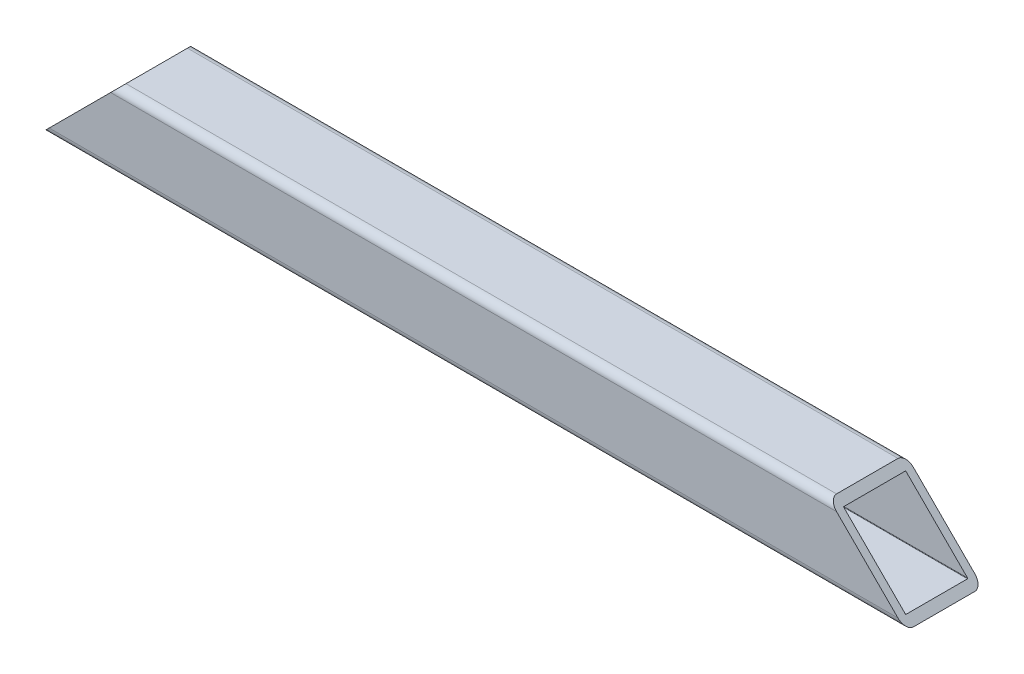
ISO-10303-21;
HEADER;
FILE_DESCRIPTION(('STEP AP214'),'2;1');
FILE_NAME('part.step','',(''),(''),'','','');
FILE_SCHEMA(('AUTOMOTIVE_DESIGN { 1 0 10303 214 1 1 1 1 }'));
ENDSEC;
DATA;
#1=APPLICATION_CONTEXT('core data for automotive mechanical design processes');
#2=APPLICATION_PROTOCOL_DEFINITION('international standard','automotive_design',2000,#1);
#3=PRODUCT_CONTEXT('',#1,'mechanical');
#4=PRODUCT('Part','Part','',(#3));
#5=PRODUCT_RELATED_PRODUCT_CATEGORY('part','',(#4));
#6=PRODUCT_DEFINITION_FORMATION('','',#4);
#7=PRODUCT_DEFINITION_CONTEXT('part definition',#1,'design');
#8=PRODUCT_DEFINITION('design','',#6,#7);
#9=PRODUCT_DEFINITION_SHAPE('','',#8);
#10=(LENGTH_UNIT() NAMED_UNIT(*) SI_UNIT(.MILLI.,.METRE.));
#11=(NAMED_UNIT(*) PLANE_ANGLE_UNIT() SI_UNIT($,.RADIAN.));
#12=(NAMED_UNIT(*) SI_UNIT($,.STERADIAN.) SOLID_ANGLE_UNIT());
#13=UNCERTAINTY_MEASURE_WITH_UNIT(LENGTH_MEASURE(1.E-05),#10,'distance_accuracy_value','');
#14=(GEOMETRIC_REPRESENTATION_CONTEXT(3) GLOBAL_UNCERTAINTY_ASSIGNED_CONTEXT((#13)) GLOBAL_UNIT_ASSIGNED_CONTEXT((#10,
#11,#12)) REPRESENTATION_CONTEXT('',''));
#15=CARTESIAN_POINT('',(0.,0.,0.));
#16=DIRECTION('',(0.,0.,1.));
#17=DIRECTION('',(1.,0.,0.));
#18=AXIS2_PLACEMENT_3D('',#15,#16,#17);
#19=CARTESIAN_POINT('',(216.991709104377,12.7,10.16));
#20=DIRECTION('',(0.,-1.,0.));
#21=DIRECTION('',(0.,0.,-1.));
#22=AXIS2_PLACEMENT_3D('',#19,#20,#21);
#23=PLANE('',#22);
#24=DIRECTION('',(-1.,0.,0.));
#25=VECTOR('',#24,1.);
#26=CARTESIAN_POINT('',(216.991709104377,12.7,-10.16));
#27=LINE('',#26,#25);
#28=CARTESIAN_POINT('',(191.591709104377,12.7,-10.16));
#29=VERTEX_POINT('',#28);
#30=CARTESIAN_POINT('',(-43.3582908956227,12.7,-10.16));
#31=VERTEX_POINT('',#30);
#32=EDGE_CURVE('E237',#29,#31,#27,.T.);
#33=ORIENTED_EDGE('',*,*,#32,.T.);
#34=DIRECTION('',(0.,0.,1.));
#35=VECTOR('',#34,1.);
#36=CARTESIAN_POINT('',(-43.3582908956227,12.7,-12.7));
#37=LINE('',#36,#35);
#38=CARTESIAN_POINT('',(-43.3582908956227,12.7,10.16));
#39=VERTEX_POINT('',#38);
#40=EDGE_CURVE('E306',#31,#39,#37,.T.);
#41=ORIENTED_EDGE('',*,*,#40,.T.);
#42=DIRECTION('',(-1.,0.,0.));
#43=VECTOR('',#42,1.);
#44=CARTESIAN_POINT('',(216.991709104377,12.7,10.16));
#45=LINE('',#44,#43);
#46=CARTESIAN_POINT('',(191.591709104377,12.7,10.16));
#47=VERTEX_POINT('',#46);
#48=EDGE_CURVE('E231',#47,#39,#45,.T.);
#49=ORIENTED_EDGE('',*,*,#48,.F.);
#50=DIRECTION('',(0.,0.,1.));
#51=VECTOR('',#50,1.);
#52=CARTESIAN_POINT('',(191.591709104377,12.7,-12.7));
#53=LINE('',#52,#51);
#54=EDGE_CURVE('E195',#29,#47,#53,.T.);
#55=ORIENTED_EDGE('',*,*,#54,.F.);
#56=EDGE_LOOP('',(#33,#41,#49,#55));
#57=FACE_BOUND('',#56,.T.);
#58=ADVANCED_FACE('F61',(#57),#23,.F.);
#59=CARTESIAN_POINT('',(216.991709104377,10.16,-10.16));
#60=DIRECTION('',(-1.,0.,0.));
#61=DIRECTION('',(0.,0.,1.));
#62=AXIS2_PLACEMENT_3D('',#59,#60,#61);
#63=CYLINDRICAL_SURFACE('',#62,2.54);
#64=DIRECTION('',(-1.,0.,0.));
#65=VECTOR('',#64,1.);
#66=CARTESIAN_POINT('',(216.991709104377,10.16,-12.7));
#67=LINE('',#66,#65);
#68=CARTESIAN_POINT('',(194.131709104377,10.16,-12.7));
#69=VERTEX_POINT('',#68);
#70=CARTESIAN_POINT('',(-45.8982908956227,10.16,-12.7));
#71=VERTEX_POINT('',#70);
#72=EDGE_CURVE('E243',#69,#71,#67,.T.);
#73=ORIENTED_EDGE('',*,*,#72,.T.);
#74=CARTESIAN_POINT('',(-45.8982908956227,10.16,-10.16));
#75=DIRECTION('',(0.707106781186544,-0.707106781186551,0.));
#76=DIRECTION('',(-0.707106781186551,-0.707106781186544,0.));
#77=AXIS2_PLACEMENT_3D('',#74,#75,#76);
#78=ELLIPSE('',#77,3.59210244842768,2.54);
#79=EDGE_CURVE('E288',#71,#31,#78,.T.);
#80=ORIENTED_EDGE('',*,*,#79,.T.);
#81=ORIENTED_EDGE('',*,*,#32,.F.);
#82=CARTESIAN_POINT('',(194.131709104377,10.16,-10.16));
#83=DIRECTION('',(-0.707106781186549,-0.707106781186546,0.));
#84=DIRECTION('',(-0.707106781186546,0.707106781186549,0.));
#85=AXIS2_PLACEMENT_3D('',#82,#83,#84);
#86=ELLIPSE('',#85,3.59210244842766,2.54);
#87=EDGE_CURVE('E268',#29,#69,#86,.T.);
#88=ORIENTED_EDGE('',*,*,#87,.T.);
#89=EDGE_LOOP('',(#73,#80,#81,#88));
#90=FACE_BOUND('',#89,.T.);
#91=ADVANCED_FACE('F320',(#90),#63,.T.);
#92=CARTESIAN_POINT('',(216.991709104377,-10.16,-12.7));
#93=DIRECTION('',(0.,0.,1.));
#94=DIRECTION('',(1.,0.,0.));
#95=AXIS2_PLACEMENT_3D('',#92,#93,#94);
#96=PLANE('',#95);
#97=DIRECTION('',(-1.,0.,0.));
#98=VECTOR('',#97,1.);
#99=CARTESIAN_POINT('',(216.991709104377,-10.16,-12.7));
#100=LINE('',#99,#98);
#101=CARTESIAN_POINT('',(214.451709104377,-10.16,-12.7));
#102=VERTEX_POINT('',#101);
#103=CARTESIAN_POINT('',(-66.2182908956229,-10.16,-12.7));
#104=VERTEX_POINT('',#103);
#105=EDGE_CURVE('E250',#102,#104,#100,.T.);
#106=ORIENTED_EDGE('',*,*,#105,.T.);
#107=DIRECTION('',(0.707106781186551,0.707106781186544,0.));
#108=VECTOR('',#107,1.);
#109=CARTESIAN_POINT('',(-68.7582908956229,-12.7,-12.7));
#110=LINE('',#109,#108);
#111=EDGE_CURVE('E194',#104,#71,#110,.T.);
#112=ORIENTED_EDGE('',*,*,#111,.T.);
#113=ORIENTED_EDGE('',*,*,#72,.F.);
#114=DIRECTION('',(0.707106781186546,-0.707106781186549,0.));
#115=VECTOR('',#114,1.);
#116=CARTESIAN_POINT('',(216.991709104377,-12.7,-12.7));
#117=LINE('',#116,#115);
#118=EDGE_CURVE('E308',#69,#102,#117,.T.);
#119=ORIENTED_EDGE('',*,*,#118,.T.);
#120=EDGE_LOOP('',(#106,#112,#113,#119));
#121=FACE_BOUND('',#120,.T.);
#122=ADVANCED_FACE('F318',(#121),#96,.F.);
#123=CARTESIAN_POINT('',(216.991709104377,-12.7,-10.16));
#124=DIRECTION('',(0.,1.,0.));
#125=DIRECTION('',(0.,0.,1.));
#126=AXIS2_PLACEMENT_3D('',#123,#124,#125);
#127=PLANE('',#126);
#128=DIRECTION('',(0.,0.,-1.));
#129=VECTOR('',#128,1.);
#130=CARTESIAN_POINT('',(-68.7582908956229,-12.7,-10.16));
#131=LINE('',#130,#129);
#132=CARTESIAN_POINT('',(-68.7582908956229,-12.7,10.16));
#133=VERTEX_POINT('',#132);
#134=CARTESIAN_POINT('',(-68.7582908956229,-12.7,-10.16));
#135=VERTEX_POINT('',#134);
#136=EDGE_CURVE('E181',#133,#135,#131,.T.);
#137=ORIENTED_EDGE('',*,*,#136,.T.);
#138=DIRECTION('',(-1.,0.,0.));
#139=VECTOR('',#138,1.);
#140=CARTESIAN_POINT('',(216.991709104377,-12.7,-10.16));
#141=LINE('',#140,#139);
#142=CARTESIAN_POINT('',(216.991709104377,-12.7,-10.16));
#143=VERTEX_POINT('',#142);
#144=EDGE_CURVE('E202',#143,#135,#141,.T.);
#145=ORIENTED_EDGE('',*,*,#144,.F.);
#146=DIRECTION('',(0.,0.,-1.));
#147=VECTOR('',#146,1.);
#148=CARTESIAN_POINT('',(216.991709104377,-12.7,-10.16));
#149=LINE('',#148,#147);
#150=CARTESIAN_POINT('',(216.991709104377,-12.7,10.16));
#151=VERTEX_POINT('',#150);
#152=EDGE_CURVE('E210',#151,#143,#149,.T.);
#153=ORIENTED_EDGE('',*,*,#152,.F.);
#154=DIRECTION('',(-1.,0.,0.));
#155=VECTOR('',#154,1.);
#156=CARTESIAN_POINT('',(216.991709104377,-12.7,10.16));
#157=LINE('',#156,#155);
#158=EDGE_CURVE('E200',#151,#133,#157,.T.);
#159=ORIENTED_EDGE('',*,*,#158,.T.);
#160=EDGE_LOOP('',(#137,#145,#153,#159));
#161=FACE_BOUND('',#160,.T.);
#162=ADVANCED_FACE('F262',(#161),#127,.F.);
#163=CARTESIAN_POINT('',(216.991709104377,-10.16,-10.16));
#164=DIRECTION('',(-1.,0.,0.));
#165=DIRECTION('',(0.,0.,1.));
#166=AXIS2_PLACEMENT_3D('',#163,#164,#165);
#167=CYLINDRICAL_SURFACE('',#166,2.54);
#168=ORIENTED_EDGE('',*,*,#144,.T.);
#169=CARTESIAN_POINT('',(-66.2182908956229,-10.16,-10.16));
#170=DIRECTION('',(0.707106781186544,-0.707106781186551,0.));
#171=DIRECTION('',(-0.707106781186551,-0.707106781186544,0.));
#172=AXIS2_PLACEMENT_3D('',#169,#170,#171);
#173=ELLIPSE('',#172,3.59210244842768,2.54);
#174=EDGE_CURVE('E187',#135,#104,#173,.T.);
#175=ORIENTED_EDGE('',*,*,#174,.T.);
#176=ORIENTED_EDGE('',*,*,#105,.F.);
#177=CARTESIAN_POINT('',(214.451709104377,-10.16,-10.16));
#178=DIRECTION('',(-0.707106781186549,-0.707106781186546,0.));
#179=DIRECTION('',(-0.707106781186546,0.707106781186549,0.));
#180=AXIS2_PLACEMENT_3D('',#177,#178,#179);
#181=ELLIPSE('',#180,3.59210244842766,2.54);
#182=EDGE_CURVE('E259',#102,#143,#181,.T.);
#183=ORIENTED_EDGE('',*,*,#182,.T.);
#184=EDGE_LOOP('',(#168,#175,#176,#183));
#185=FACE_BOUND('',#184,.T.);
#186=ADVANCED_FACE('F257',(#185),#167,.T.);
#187=CARTESIAN_POINT('',(216.991709104377,-10.16,10.16));
#188=DIRECTION('',(-1.,0.,0.));
#189=DIRECTION('',(0.,0.,1.));
#190=AXIS2_PLACEMENT_3D('',#187,#188,#189);
#191=CYLINDRICAL_SURFACE('',#190,2.54);
#192=DIRECTION('',(-1.,0.,0.));
#193=VECTOR('',#192,1.);
#194=CARTESIAN_POINT('',(216.991709104377,-10.16,12.7));
#195=LINE('',#194,#193);
#196=CARTESIAN_POINT('',(214.451709104377,-10.16,12.7));
#197=VERTEX_POINT('',#196);
#198=CARTESIAN_POINT('',(-66.218290895623,-10.16,12.7));
#199=VERTEX_POINT('',#198);
#200=EDGE_CURVE('E70',#197,#199,#195,.T.);
#201=ORIENTED_EDGE('',*,*,#200,.T.);
#202=CARTESIAN_POINT('',(-66.2182908956229,-10.16,10.16));
#203=DIRECTION('',(0.707106781186544,-0.707106781186551,0.));
#204=DIRECTION('',(-0.707106781186551,-0.707106781186544,0.));
#205=AXIS2_PLACEMENT_3D('',#202,#203,#204);
#206=ELLIPSE('',#205,3.59210244842768,2.54);
#207=EDGE_CURVE('E175',#199,#133,#206,.T.);
#208=ORIENTED_EDGE('',*,*,#207,.T.);
#209=ORIENTED_EDGE('',*,*,#158,.F.);
#210=CARTESIAN_POINT('',(214.451709104377,-10.16,10.16));
#211=DIRECTION('',(-0.707106781186549,-0.707106781186546,0.));
#212=DIRECTION('',(-0.707106781186546,0.707106781186549,0.));
#213=AXIS2_PLACEMENT_3D('',#210,#211,#212);
#214=ELLIPSE('',#213,3.59210244842766,2.54);
#215=EDGE_CURVE('E199',#151,#197,#214,.T.);
#216=ORIENTED_EDGE('',*,*,#215,.T.);
#217=EDGE_LOOP('',(#201,#208,#209,#216));
#218=FACE_BOUND('',#217,.T.);
#219=ADVANCED_FACE('F198',(#218),#191,.T.);
#220=CARTESIAN_POINT('',(216.991709104377,10.16,12.7));
#221=DIRECTION('',(0.,0.,-1.));
#222=DIRECTION('',(-1.,0.,0.));
#223=AXIS2_PLACEMENT_3D('',#220,#221,#222);
#224=PLANE('',#223);
#225=DIRECTION('',(-1.,0.,0.));
#226=VECTOR('',#225,1.);
#227=CARTESIAN_POINT('',(216.991709104377,10.16,12.7));
#228=LINE('',#227,#226);
#229=CARTESIAN_POINT('',(194.131709104377,10.16,12.7));
#230=VERTEX_POINT('',#229);
#231=CARTESIAN_POINT('',(-45.8982908956227,10.16,12.7));
#232=VERTEX_POINT('',#231);
#233=EDGE_CURVE('E12',#230,#232,#228,.T.);
#234=ORIENTED_EDGE('',*,*,#233,.T.);
#235=DIRECTION('',(0.707106781186551,0.707106781186544,0.));
#236=VECTOR('',#235,1.);
#237=CARTESIAN_POINT('',(-68.7582908956229,-12.7,12.7));
#238=LINE('',#237,#236);
#239=EDGE_CURVE('E178',#199,#232,#238,.T.);
#240=ORIENTED_EDGE('',*,*,#239,.F.);
#241=ORIENTED_EDGE('',*,*,#200,.F.);
#242=DIRECTION('',(0.707106781186546,-0.707106781186549,0.));
#243=VECTOR('',#242,1.);
#244=CARTESIAN_POINT('',(216.991709104377,-12.7,12.7));
#245=LINE('',#244,#243);
#246=EDGE_CURVE('E311',#230,#197,#245,.T.);
#247=ORIENTED_EDGE('',*,*,#246,.F.);
#248=EDGE_LOOP('',(#234,#240,#241,#247));
#249=FACE_BOUND('',#248,.T.);
#250=ADVANCED_FACE('F191',(#249),#224,.F.);
#251=CARTESIAN_POINT('',(216.991709104377,10.16,10.16));
#252=DIRECTION('',(-1.,0.,0.));
#253=DIRECTION('',(0.,0.,1.));
#254=AXIS2_PLACEMENT_3D('',#251,#252,#253);
#255=CYLINDRICAL_SURFACE('',#254,2.54);
#256=ORIENTED_EDGE('',*,*,#48,.T.);
#257=CARTESIAN_POINT('',(-45.8982908956227,10.16,10.16));
#258=DIRECTION('',(0.707106781186544,-0.707106781186551,0.));
#259=DIRECTION('',(-0.707106781186551,-0.707106781186544,0.));
#260=AXIS2_PLACEMENT_3D('',#257,#258,#259);
#261=ELLIPSE('',#260,3.59210244842768,2.54);
#262=EDGE_CURVE('E186',#39,#232,#261,.T.);
#263=ORIENTED_EDGE('',*,*,#262,.T.);
#264=ORIENTED_EDGE('',*,*,#233,.F.);
#265=CARTESIAN_POINT('',(194.131709104377,10.16,10.16));
#266=DIRECTION('',(-0.707106781186549,-0.707106781186546,0.));
#267=DIRECTION('',(-0.707106781186546,0.707106781186549,0.));
#268=AXIS2_PLACEMENT_3D('',#265,#266,#267);
#269=ELLIPSE('',#268,3.59210244842766,2.54);
#270=EDGE_CURVE('E263',#230,#47,#269,.T.);
#271=ORIENTED_EDGE('',*,*,#270,.T.);
#272=EDGE_LOOP('',(#256,#263,#264,#271));
#273=FACE_BOUND('',#272,.T.);
#274=ADVANCED_FACE('F326',(#273),#255,.T.);
#275=CARTESIAN_POINT('',(-68.7582908956229,-12.7,-12.7));
#276=DIRECTION('',(0.707106781186544,-0.707106781186551,0.));
#277=DIRECTION('',(0.707106781186551,0.707106781186544,0.));
#278=AXIS2_PLACEMENT_3D('',#275,#276,#277);
#279=PLANE('',#278);
#280=CARTESIAN_POINT('',(-66.2182908956229,-10.16,10.16));
#281=DIRECTION('',(0.707106781186544,-0.707106781186551,0.));
#282=DIRECTION('',(-0.707106781186551,-0.707106781186544,0.));
#283=AXIS2_PLACEMENT_3D('',#280,#281,#282);
#284=ELLIPSE('',#283,0.179605122421387,0.127000000000002);
#285=CARTESIAN_POINT('',(-66.2182908956229,-10.16,10.287));
#286=VERTEX_POINT('',#285);
#287=CARTESIAN_POINT('',(-66.3452908956229,-10.287,10.16));
#288=VERTEX_POINT('',#287);
#289=EDGE_CURVE('E86',#286,#288,#284,.T.);
#290=ORIENTED_EDGE('',*,*,#289,.T.);
#291=DIRECTION('',(0.,0.,-1.));
#292=VECTOR('',#291,1.);
#293=CARTESIAN_POINT('',(-66.3452908956229,-10.287,-10.16));
#294=LINE('',#293,#292);
#295=CARTESIAN_POINT('',(-66.3452908956229,-10.287,-10.16));
#296=VERTEX_POINT('',#295);
#297=EDGE_CURVE('E304',#288,#296,#294,.T.);
#298=ORIENTED_EDGE('',*,*,#297,.T.);
#299=CARTESIAN_POINT('',(-66.2182908956229,-10.16,-10.16));
#300=DIRECTION('',(0.707106781186544,-0.707106781186551,0.));
#301=DIRECTION('',(-0.707106781186551,-0.707106781186544,0.));
#302=AXIS2_PLACEMENT_3D('',#299,#300,#301);
#303=ELLIPSE('',#302,0.179605122421387,0.127000000000002);
#304=CARTESIAN_POINT('',(-66.2182908956229,-10.16,-10.287));
#305=VERTEX_POINT('',#304);
#306=EDGE_CURVE('E302',#296,#305,#303,.T.);
#307=ORIENTED_EDGE('',*,*,#306,.T.);
#308=DIRECTION('',(0.707106781186551,0.707106781186544,0.));
#309=VECTOR('',#308,1.);
#310=CARTESIAN_POINT('',(75.3867091043785,131.445,-10.287));
#311=LINE('',#310,#309);
#312=CARTESIAN_POINT('',(-45.8982908956227,10.16,-10.287));
#313=VERTEX_POINT('',#312);
#314=EDGE_CURVE('E300',#305,#313,#311,.T.);
#315=ORIENTED_EDGE('',*,*,#314,.T.);
#316=CARTESIAN_POINT('',(-45.8982908956227,10.16,-10.16));
#317=DIRECTION('',(0.707106781186544,-0.707106781186551,0.));
#318=DIRECTION('',(-0.707106781186551,-0.707106781186544,0.));
#319=AXIS2_PLACEMENT_3D('',#316,#317,#318);
#320=ELLIPSE('',#319,0.179605122421387,0.127000000000002);
#321=CARTESIAN_POINT('',(-45.7712908956227,10.287,-10.16));
#322=VERTEX_POINT('',#321);
#323=EDGE_CURVE('E298',#313,#322,#320,.T.);
#324=ORIENTED_EDGE('',*,*,#323,.T.);
#325=DIRECTION('',(0.,0.,1.));
#326=VECTOR('',#325,1.);
#327=CARTESIAN_POINT('',(-45.7712908956227,10.287,10.16));
#328=LINE('',#327,#326);
#329=CARTESIAN_POINT('',(-45.7712908956227,10.287,10.16));
#330=VERTEX_POINT('',#329);
#331=EDGE_CURVE('E296',#322,#330,#328,.T.);
#332=ORIENTED_EDGE('',*,*,#331,.T.);
#333=CARTESIAN_POINT('',(-45.8982908956227,10.16,10.16));
#334=DIRECTION('',(0.707106781186544,-0.707106781186551,0.));
#335=DIRECTION('',(-0.707106781186551,-0.707106781186544,0.));
#336=AXIS2_PLACEMENT_3D('',#333,#334,#335);
#337=ELLIPSE('',#336,0.179605122421387,0.127000000000002);
#338=CARTESIAN_POINT('',(-45.8982908956227,10.16,10.287));
#339=VERTEX_POINT('',#338);
#340=EDGE_CURVE('E294',#330,#339,#337,.T.);
#341=ORIENTED_EDGE('',*,*,#340,.T.);
#342=DIRECTION('',(-0.707106781186551,-0.707106781186544,0.));
#343=VECTOR('',#342,1.);
#344=CARTESIAN_POINT('',(85.5467091043785,141.605,10.287));
#345=LINE('',#344,#343);
#346=EDGE_CURVE('E292',#339,#286,#345,.T.);
#347=ORIENTED_EDGE('',*,*,#346,.T.);
#348=EDGE_LOOP('',(#290,#298,#307,#315,#324,#332,#341,#347));
#349=FACE_BOUND('',#348,.T.);
#350=ORIENTED_EDGE('',*,*,#40,.F.);
#351=ORIENTED_EDGE('',*,*,#79,.F.);
#352=ORIENTED_EDGE('',*,*,#111,.F.);
#353=ORIENTED_EDGE('',*,*,#174,.F.);
#354=ORIENTED_EDGE('',*,*,#136,.F.);
#355=ORIENTED_EDGE('',*,*,#207,.F.);
#356=ORIENTED_EDGE('',*,*,#239,.T.);
#357=ORIENTED_EDGE('',*,*,#262,.F.);
#358=EDGE_LOOP('',(#350,#351,#352,#353,#354,#355,#356,#357));
#359=FACE_BOUND('',#358,.T.);
#360=ADVANCED_FACE('F177',(#349,#359),#279,.F.);
#361=CARTESIAN_POINT('',(216.991709104377,-12.7,-12.7));
#362=DIRECTION('',(-0.707106781186549,-0.707106781186546,0.));
#363=DIRECTION('',(0.707106781186546,-0.707106781186549,0.));
#364=AXIS2_PLACEMENT_3D('',#361,#362,#363);
#365=PLANE('',#364);
#366=CARTESIAN_POINT('',(214.451709104377,-10.16,10.16));
#367=DIRECTION('',(-0.707106781186549,-0.707106781186546,0.));
#368=DIRECTION('',(-0.707106781186546,0.707106781186549,0.));
#369=AXIS2_PLACEMENT_3D('',#366,#367,#368);
#370=ELLIPSE('',#369,0.179605122421386,0.127000000000002);
#371=CARTESIAN_POINT('',(214.578709104377,-10.287,10.16));
#372=VERTEX_POINT('',#371);
#373=CARTESIAN_POINT('',(214.451709104377,-10.16,10.287));
#374=VERTEX_POINT('',#373);
#375=EDGE_CURVE('E271',#372,#374,#370,.T.);
#376=ORIENTED_EDGE('',*,*,#375,.T.);
#377=DIRECTION('',(-0.707106781186546,0.707106781186549,0.));
#378=VECTOR('',#377,1.);
#379=CARTESIAN_POINT('',(205.561709104377,-1.26999999999996,10.287));
#380=LINE('',#379,#378);
#381=CARTESIAN_POINT('',(194.131709104377,10.16,10.287));
#382=VERTEX_POINT('',#381);
#383=EDGE_CURVE('E273',#374,#382,#380,.T.);
#384=ORIENTED_EDGE('',*,*,#383,.T.);
#385=CARTESIAN_POINT('',(194.131709104377,10.16,10.16));
#386=DIRECTION('',(-0.707106781186549,-0.707106781186546,0.));
#387=DIRECTION('',(-0.707106781186546,0.707106781186549,0.));
#388=AXIS2_PLACEMENT_3D('',#385,#386,#387);
#389=ELLIPSE('',#388,0.179605122421386,0.127000000000002);
#390=CARTESIAN_POINT('',(194.004709104377,10.287,10.16));
#391=VERTEX_POINT('',#390);
#392=EDGE_CURVE('E275',#382,#391,#389,.T.);
#393=ORIENTED_EDGE('',*,*,#392,.T.);
#394=DIRECTION('',(0.,0.,-1.));
#395=VECTOR('',#394,1.);
#396=CARTESIAN_POINT('',(194.004709104377,10.287,10.16));
#397=LINE('',#396,#395);
#398=CARTESIAN_POINT('',(194.004709104377,10.287,-10.16));
#399=VERTEX_POINT('',#398);
#400=EDGE_CURVE('E277',#391,#399,#397,.T.);
#401=ORIENTED_EDGE('',*,*,#400,.T.);
#402=CARTESIAN_POINT('',(194.131709104377,10.16,-10.16));
#403=DIRECTION('',(-0.707106781186549,-0.707106781186546,0.));
#404=DIRECTION('',(-0.707106781186546,0.707106781186549,0.));
#405=AXIS2_PLACEMENT_3D('',#402,#403,#404);
#406=ELLIPSE('',#405,0.179605122421386,0.127000000000002);
#407=CARTESIAN_POINT('',(194.131709104377,10.16,-10.287));
#408=VERTEX_POINT('',#407);
#409=EDGE_CURVE('E279',#399,#408,#406,.T.);
#410=ORIENTED_EDGE('',*,*,#409,.T.);
#411=DIRECTION('',(0.707106781186546,-0.707106781186549,0.));
#412=VECTOR('',#411,1.);
#413=CARTESIAN_POINT('',(215.721709104377,-11.43,-10.287));
#414=LINE('',#413,#412);
#415=CARTESIAN_POINT('',(214.451709104377,-10.16,-10.287));
#416=VERTEX_POINT('',#415);
#417=EDGE_CURVE('E281',#408,#416,#414,.T.);
#418=ORIENTED_EDGE('',*,*,#417,.T.);
#419=CARTESIAN_POINT('',(214.451709104377,-10.16,-10.16));
#420=DIRECTION('',(-0.707106781186549,-0.707106781186546,0.));
#421=DIRECTION('',(-0.707106781186546,0.707106781186549,0.));
#422=AXIS2_PLACEMENT_3D('',#419,#420,#421);
#423=ELLIPSE('',#422,0.179605122421386,0.127000000000002);
#424=CARTESIAN_POINT('',(214.578709104377,-10.287,-10.16));
#425=VERTEX_POINT('',#424);
#426=EDGE_CURVE('E78',#416,#425,#423,.T.);
#427=ORIENTED_EDGE('',*,*,#426,.T.);
#428=DIRECTION('',(0.,0.,1.));
#429=VECTOR('',#428,1.);
#430=CARTESIAN_POINT('',(214.578709104377,-10.287,-10.16));
#431=LINE('',#430,#429);
#432=EDGE_CURVE('E284',#425,#372,#431,.T.);
#433=ORIENTED_EDGE('',*,*,#432,.T.);
#434=EDGE_LOOP('',(#376,#384,#393,#401,#410,#418,#427,#433));
#435=FACE_BOUND('',#434,.T.);
#436=ORIENTED_EDGE('',*,*,#246,.T.);
#437=ORIENTED_EDGE('',*,*,#215,.F.);
#438=ORIENTED_EDGE('',*,*,#152,.T.);
#439=ORIENTED_EDGE('',*,*,#182,.F.);
#440=ORIENTED_EDGE('',*,*,#118,.F.);
#441=ORIENTED_EDGE('',*,*,#87,.F.);
#442=ORIENTED_EDGE('',*,*,#54,.T.);
#443=ORIENTED_EDGE('',*,*,#270,.F.);
#444=EDGE_LOOP('',(#436,#437,#438,#439,#440,#441,#442,#443));
#445=FACE_BOUND('',#444,.T.);
#446=ADVANCED_FACE('F324',(#435,#445),#365,.F.);
#447=CARTESIAN_POINT('',(216.991709104377,-10.16,10.16));
#448=DIRECTION('',(-1.,0.,0.));
#449=DIRECTION('',(0.,0.,1.));
#450=AXIS2_PLACEMENT_3D('',#447,#448,#449);
#451=CYLINDRICAL_SURFACE('',#450,0.127000000000002);
#452=ORIENTED_EDGE('',*,*,#289,.F.);
#453=DIRECTION('',(-1.,0.,0.));
#454=VECTOR('',#453,1.);
#455=CARTESIAN_POINT('',(216.991709104377,-10.16,10.287));
#456=LINE('',#455,#454);
#457=EDGE_CURVE('E65',#374,#286,#456,.T.);
#458=ORIENTED_EDGE('',*,*,#457,.F.);
#459=ORIENTED_EDGE('',*,*,#375,.F.);
#460=DIRECTION('',(-1.,0.,0.));
#461=VECTOR('',#460,1.);
#462=CARTESIAN_POINT('',(216.991709104377,-10.287,10.16));
#463=LINE('',#462,#461);
#464=EDGE_CURVE('E206',#372,#288,#463,.T.);
#465=ORIENTED_EDGE('',*,*,#464,.T.);
#466=EDGE_LOOP('',(#452,#458,#459,#465));
#467=FACE_BOUND('',#466,.T.);
#468=ADVANCED_FACE('F63',(#467),#451,.F.);
#469=CARTESIAN_POINT('',(216.991709104377,10.16,10.287));
#470=DIRECTION('',(0.,0.,-1.));
#471=DIRECTION('',(-1.,0.,0.));
#472=AXIS2_PLACEMENT_3D('',#469,#470,#471);
#473=PLANE('',#472);
#474=ORIENTED_EDGE('',*,*,#346,.F.);
#475=DIRECTION('',(-1.,0.,0.));
#476=VECTOR('',#475,1.);
#477=CARTESIAN_POINT('',(216.991709104377,10.16,10.287));
#478=LINE('',#477,#476);
#479=EDGE_CURVE('E224',#382,#339,#478,.T.);
#480=ORIENTED_EDGE('',*,*,#479,.F.);
#481=ORIENTED_EDGE('',*,*,#383,.F.);
#482=ORIENTED_EDGE('',*,*,#457,.T.);
#483=EDGE_LOOP('',(#474,#480,#481,#482));
#484=FACE_BOUND('',#483,.T.);
#485=ADVANCED_FACE('F388',(#484),#473,.T.);
#486=CARTESIAN_POINT('',(216.991709104377,10.16,10.16));
#487=DIRECTION('',(-1.,0.,0.));
#488=DIRECTION('',(0.,0.,1.));
#489=AXIS2_PLACEMENT_3D('',#486,#487,#488);
#490=CYLINDRICAL_SURFACE('',#489,0.127000000000002);
#491=ORIENTED_EDGE('',*,*,#340,.F.);
#492=DIRECTION('',(-1.,0.,0.));
#493=VECTOR('',#492,1.);
#494=CARTESIAN_POINT('',(216.991709104377,10.287,10.16));
#495=LINE('',#494,#493);
#496=EDGE_CURVE('E222',#391,#330,#495,.T.);
#497=ORIENTED_EDGE('',*,*,#496,.F.);
#498=ORIENTED_EDGE('',*,*,#392,.F.);
#499=ORIENTED_EDGE('',*,*,#479,.T.);
#500=EDGE_LOOP('',(#491,#497,#498,#499));
#501=FACE_BOUND('',#500,.T.);
#502=ADVANCED_FACE('F399',(#501),#490,.F.);
#503=CARTESIAN_POINT('',(216.991709104377,10.287,10.16));
#504=DIRECTION('',(0.,-1.,0.));
#505=DIRECTION('',(0.,0.,-1.));
#506=AXIS2_PLACEMENT_3D('',#503,#504,#505);
#507=PLANE('',#506);
#508=ORIENTED_EDGE('',*,*,#331,.F.);
#509=DIRECTION('',(-1.,0.,0.));
#510=VECTOR('',#509,1.);
#511=CARTESIAN_POINT('',(216.991709104377,10.287,-10.16));
#512=LINE('',#511,#510);
#513=EDGE_CURVE('E219',#399,#322,#512,.T.);
#514=ORIENTED_EDGE('',*,*,#513,.F.);
#515=ORIENTED_EDGE('',*,*,#400,.F.);
#516=ORIENTED_EDGE('',*,*,#496,.T.);
#517=EDGE_LOOP('',(#508,#514,#515,#516));
#518=FACE_BOUND('',#517,.T.);
#519=ADVANCED_FACE('F408',(#518),#507,.T.);
#520=CARTESIAN_POINT('',(216.991709104377,10.16,-10.16));
#521=DIRECTION('',(-1.,0.,0.));
#522=DIRECTION('',(0.,0.,1.));
#523=AXIS2_PLACEMENT_3D('',#520,#521,#522);
#524=CYLINDRICAL_SURFACE('',#523,0.127000000000002);
#525=ORIENTED_EDGE('',*,*,#323,.F.);
#526=DIRECTION('',(-1.,0.,0.));
#527=VECTOR('',#526,1.);
#528=CARTESIAN_POINT('',(216.991709104377,10.16,-10.287));
#529=LINE('',#528,#527);
#530=EDGE_CURVE('E216',#408,#313,#529,.T.);
#531=ORIENTED_EDGE('',*,*,#530,.F.);
#532=ORIENTED_EDGE('',*,*,#409,.F.);
#533=ORIENTED_EDGE('',*,*,#513,.T.);
#534=EDGE_LOOP('',(#525,#531,#532,#533));
#535=FACE_BOUND('',#534,.T.);
#536=ADVANCED_FACE('F418',(#535),#524,.F.);
#537=CARTESIAN_POINT('',(216.991709104377,-10.16,-10.287));
#538=DIRECTION('',(0.,0.,1.));
#539=DIRECTION('',(1.,0.,0.));
#540=AXIS2_PLACEMENT_3D('',#537,#538,#539);
#541=PLANE('',#540);
#542=ORIENTED_EDGE('',*,*,#314,.F.);
#543=DIRECTION('',(-1.,0.,0.));
#544=VECTOR('',#543,1.);
#545=CARTESIAN_POINT('',(216.991709104377,-10.16,-10.287));
#546=LINE('',#545,#544);
#547=EDGE_CURVE('E213',#416,#305,#546,.T.);
#548=ORIENTED_EDGE('',*,*,#547,.F.);
#549=ORIENTED_EDGE('',*,*,#417,.F.);
#550=ORIENTED_EDGE('',*,*,#530,.T.);
#551=EDGE_LOOP('',(#542,#548,#549,#550));
#552=FACE_BOUND('',#551,.T.);
#553=ADVANCED_FACE('F429',(#552),#541,.T.);
#554=CARTESIAN_POINT('',(216.991709104377,-10.16,-10.16));
#555=DIRECTION('',(-1.,0.,0.));
#556=DIRECTION('',(0.,0.,1.));
#557=AXIS2_PLACEMENT_3D('',#554,#555,#556);
#558=CYLINDRICAL_SURFACE('',#557,0.127000000000002);
#559=ORIENTED_EDGE('',*,*,#306,.F.);
#560=DIRECTION('',(-1.,0.,0.));
#561=VECTOR('',#560,1.);
#562=CARTESIAN_POINT('',(216.991709104377,-10.287,-10.16));
#563=LINE('',#562,#561);
#564=EDGE_CURVE('E209',#425,#296,#563,.T.);
#565=ORIENTED_EDGE('',*,*,#564,.F.);
#566=ORIENTED_EDGE('',*,*,#426,.F.);
#567=ORIENTED_EDGE('',*,*,#547,.T.);
#568=EDGE_LOOP('',(#559,#565,#566,#567));
#569=FACE_BOUND('',#568,.T.);
#570=ADVANCED_FACE('F440',(#569),#558,.F.);
#571=CARTESIAN_POINT('',(216.991709104377,-10.287,-10.16));
#572=DIRECTION('',(0.,1.,0.));
#573=DIRECTION('',(0.,0.,1.));
#574=AXIS2_PLACEMENT_3D('',#571,#572,#573);
#575=PLANE('',#574);
#576=ORIENTED_EDGE('',*,*,#297,.F.);
#577=ORIENTED_EDGE('',*,*,#464,.F.);
#578=ORIENTED_EDGE('',*,*,#432,.F.);
#579=ORIENTED_EDGE('',*,*,#564,.T.);
#580=EDGE_LOOP('',(#576,#577,#578,#579));
#581=FACE_BOUND('',#580,.T.);
#582=ADVANCED_FACE('F451',(#581),#575,.T.);
#583=CLOSED_SHELL('',(#58,#91,#122,#162,#186,#219,#250,#274,#360,#446,#468,#485,#502,#519,#536,
#553,#570,#582));
#584=MANIFOLD_SOLID_BREP('B2',#583);
#585=ADVANCED_BREP_SHAPE_REPRESENTATION('',(#18,#584),#14);
#586=SHAPE_DEFINITION_REPRESENTATION(#9,#585);
ENDSEC;
END-ISO-10303-21;
